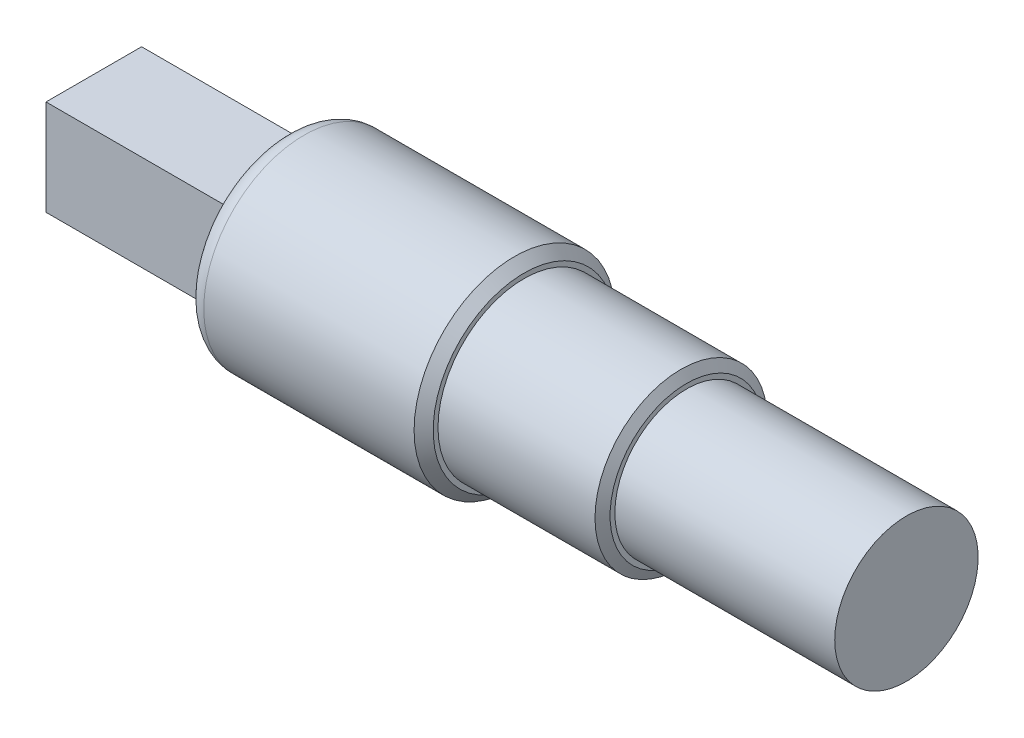
ISO-10303-21;
HEADER;
FILE_DESCRIPTION(('STEP AP214'),'2;1');
FILE_NAME('part.step','',(''),(''),'','','');
FILE_SCHEMA(('AUTOMOTIVE_DESIGN { 1 0 10303 214 1 1 1 1 }'));
ENDSEC;
DATA;
#1=APPLICATION_CONTEXT('core data for automotive mechanical design processes');
#2=APPLICATION_PROTOCOL_DEFINITION('international standard','automotive_design',2000,#1);
#3=PRODUCT_CONTEXT('',#1,'mechanical');
#4=PRODUCT('Part','Part','',(#3));
#5=PRODUCT_RELATED_PRODUCT_CATEGORY('part','',(#4));
#6=PRODUCT_DEFINITION_FORMATION('','',#4);
#7=PRODUCT_DEFINITION_CONTEXT('part definition',#1,'design');
#8=PRODUCT_DEFINITION('design','',#6,#7);
#9=PRODUCT_DEFINITION_SHAPE('','',#8);
#10=(LENGTH_UNIT() NAMED_UNIT(*) SI_UNIT(.MILLI.,.METRE.));
#11=(NAMED_UNIT(*) PLANE_ANGLE_UNIT() SI_UNIT($,.RADIAN.));
#12=(NAMED_UNIT(*) SI_UNIT($,.STERADIAN.) SOLID_ANGLE_UNIT());
#13=UNCERTAINTY_MEASURE_WITH_UNIT(LENGTH_MEASURE(1.E-05),#10,'distance_accuracy_value','');
#14=(GEOMETRIC_REPRESENTATION_CONTEXT(3) GLOBAL_UNCERTAINTY_ASSIGNED_CONTEXT((#13)) GLOBAL_UNIT_ASSIGNED_CONTEXT((#10,
#11,#12)) REPRESENTATION_CONTEXT('',''));
#15=CARTESIAN_POINT('',(0.,0.,0.));
#16=DIRECTION('',(0.,0.,1.));
#17=DIRECTION('',(1.,0.,0.));
#18=AXIS2_PLACEMENT_3D('',#15,#16,#17);
#19=CARTESIAN_POINT('',(0.,0.,0.));
#20=DIRECTION('',(-1.,0.,0.));
#21=DIRECTION('',(0.,0.,1.));
#22=AXIS2_PLACEMENT_3D('',#19,#20,#21);
#23=PLANE('',#22);
#24=CARTESIAN_POINT('',(0.,0.,0.));
#25=DIRECTION('',(-1.,0.,0.));
#26=DIRECTION('',(0.,0.,1.));
#27=AXIS2_PLACEMENT_3D('',#24,#25,#26);
#28=CIRCLE('',#27,8.5);
#29=CARTESIAN_POINT('',(0.,0.,8.5));
#30=VERTEX_POINT('',#29);
#31=EDGE_CURVE('E115',#30,#30,#28,.T.);
#32=ORIENTED_EDGE('',*,*,#31,.T.);
#33=EDGE_LOOP('',(#32));
#34=FACE_BOUND('',#33,.T.);
#35=DIRECTION('',(0.,1.,0.));
#36=VECTOR('',#35,1.);
#37=CARTESIAN_POINT('',(0.,-5.,5.));
#38=LINE('',#37,#36);
#39=CARTESIAN_POINT('',(0.,-5.,5.));
#40=VERTEX_POINT('',#39);
#41=CARTESIAN_POINT('',(0.,5.,5.));
#42=VERTEX_POINT('',#41);
#43=EDGE_CURVE('E55',#40,#42,#38,.T.);
#44=ORIENTED_EDGE('',*,*,#43,.F.);
#45=DIRECTION('',(0.,0.,1.));
#46=VECTOR('',#45,1.);
#47=CARTESIAN_POINT('',(0.,-5.,-5.));
#48=LINE('',#47,#46);
#49=CARTESIAN_POINT('',(0.,-5.,-5.));
#50=VERTEX_POINT('',#49);
#51=EDGE_CURVE('E59',#50,#40,#48,.T.);
#52=ORIENTED_EDGE('',*,*,#51,.F.);
#53=DIRECTION('',(0.,-1.,0.));
#54=VECTOR('',#53,1.);
#55=CARTESIAN_POINT('',(0.,-5.,-5.));
#56=LINE('',#55,#54);
#57=CARTESIAN_POINT('',(0.,5.,-5.));
#58=VERTEX_POINT('',#57);
#59=EDGE_CURVE('E290',#58,#50,#56,.T.);
#60=ORIENTED_EDGE('',*,*,#59,.F.);
#61=DIRECTION('',(0.,0.,-1.));
#62=VECTOR('',#61,1.);
#63=CARTESIAN_POINT('',(0.,5.,-5.));
#64=LINE('',#63,#62);
#65=EDGE_CURVE('E292',#42,#58,#64,.T.);
#66=ORIENTED_EDGE('',*,*,#65,.F.);
#67=EDGE_LOOP('',(#44,#52,#60,#66));
#68=FACE_BOUND('',#67,.T.);
#69=ADVANCED_FACE('F39',(#34,#68),#23,.T.);
#70=CARTESIAN_POINT('',(0.,0.,0.));
#71=DIRECTION('',(-1.,0.,0.));
#72=DIRECTION('',(0.,0.,1.));
#73=AXIS2_PLACEMENT_3D('',#70,#71,#72);
#74=CYLINDRICAL_SURFACE('',#73,10.5);
#75=CARTESIAN_POINT('',(24.,0.,0.));
#76=DIRECTION('',(1.,0.,0.));
#77=DIRECTION('',(0.,0.,-1.));
#78=AXIS2_PLACEMENT_3D('',#75,#76,#77);
#79=CIRCLE('',#78,10.5);
#80=CARTESIAN_POINT('',(24.,0.,-10.5));
#81=VERTEX_POINT('',#80);
#82=EDGE_CURVE('E121',#81,#81,#79,.F.);
#83=ORIENTED_EDGE('',*,*,#82,.T.);
#84=EDGE_LOOP('',(#83));
#85=FACE_BOUND('',#84,.T.);
#86=CARTESIAN_POINT('',(2.,0.,0.));
#87=DIRECTION('',(-1.,0.,0.));
#88=DIRECTION('',(0.,0.,1.));
#89=AXIS2_PLACEMENT_3D('',#86,#87,#88);
#90=CIRCLE('',#89,10.5);
#91=CARTESIAN_POINT('',(2.,0.,10.5));
#92=VERTEX_POINT('',#91);
#93=EDGE_CURVE('E118',#92,#92,#90,.F.);
#94=ORIENTED_EDGE('',*,*,#93,.T.);
#95=EDGE_LOOP('',(#94));
#96=FACE_BOUND('',#95,.T.);
#97=ADVANCED_FACE('F142',(#85,#96),#74,.T.);
#98=CARTESIAN_POINT('',(25.,-10.5,0.));
#99=DIRECTION('',(1.,0.,0.));
#100=DIRECTION('',(0.,0.,-1.));
#101=AXIS2_PLACEMENT_3D('',#98,#99,#100);
#102=PLANE('',#101);
#103=CARTESIAN_POINT('',(25.,0.,0.));
#104=DIRECTION('',(1.,0.,0.));
#105=DIRECTION('',(0.,0.,-1.));
#106=AXIS2_PLACEMENT_3D('',#103,#104,#105);
#107=CIRCLE('',#106,9.49999999999997);
#108=CARTESIAN_POINT('',(25.,0.,-9.49999999999997));
#109=VERTEX_POINT('',#108);
#110=EDGE_CURVE('E124',#109,#109,#107,.T.);
#111=ORIENTED_EDGE('',*,*,#110,.T.);
#112=EDGE_LOOP('',(#111));
#113=FACE_BOUND('',#112,.T.);
#114=CARTESIAN_POINT('',(25.,0.,0.));
#115=DIRECTION('',(-1.,0.,0.));
#116=DIRECTION('',(0.,0.,1.));
#117=AXIS2_PLACEMENT_3D('',#114,#115,#116);
#118=CIRCLE('',#117,9.);
#119=CARTESIAN_POINT('',(25.,0.,9.));
#120=VERTEX_POINT('',#119);
#121=EDGE_CURVE('E112',#120,#120,#118,.T.);
#122=ORIENTED_EDGE('',*,*,#121,.T.);
#123=EDGE_LOOP('',(#122));
#124=FACE_BOUND('',#123,.T.);
#125=ADVANCED_FACE('F148',(#113,#124),#102,.T.);
#126=CARTESIAN_POINT('',(0.,0.,0.));
#127=DIRECTION('',(-1.,0.,0.));
#128=DIRECTION('',(0.,0.,1.));
#129=AXIS2_PLACEMENT_3D('',#126,#127,#128);
#130=CYLINDRICAL_SURFACE('',#129,9.);
#131=CARTESIAN_POINT('',(41.4226497308104,0.,0.));
#132=DIRECTION('',(1.,0.,0.));
#133=DIRECTION('',(0.,0.,-1.));
#134=AXIS2_PLACEMENT_3D('',#131,#132,#133);
#135=CIRCLE('',#134,9.);
#136=CARTESIAN_POINT('',(41.4226497308104,0.,-9.));
#137=VERTEX_POINT('',#136);
#138=EDGE_CURVE('E48',#137,#137,#135,.F.);
#139=ORIENTED_EDGE('',*,*,#138,.T.);
#140=EDGE_LOOP('',(#139));
#141=FACE_BOUND('',#140,.T.);
#142=ORIENTED_EDGE('',*,*,#121,.F.);
#143=EDGE_LOOP('',(#142));
#144=FACE_BOUND('',#143,.T.);
#145=ADVANCED_FACE('F129',(#141,#144),#130,.T.);
#146=CARTESIAN_POINT('',(42.,-9.,0.));
#147=DIRECTION('',(1.,0.,0.));
#148=DIRECTION('',(0.,0.,-1.));
#149=AXIS2_PLACEMENT_3D('',#146,#147,#148);
#150=PLANE('',#149);
#151=CARTESIAN_POINT('',(42.,0.,0.));
#152=DIRECTION('',(1.,0.,0.));
#153=DIRECTION('',(0.,0.,-1.));
#154=AXIS2_PLACEMENT_3D('',#151,#152,#153);
#155=CIRCLE('',#154,8.00000000000001);
#156=CARTESIAN_POINT('',(42.,0.,-8.00000000000001));
#157=VERTEX_POINT('',#156);
#158=EDGE_CURVE('E11',#157,#157,#155,.T.);
#159=ORIENTED_EDGE('',*,*,#158,.T.);
#160=EDGE_LOOP('',(#159));
#161=FACE_BOUND('',#160,.T.);
#162=CARTESIAN_POINT('',(42.,0.,0.));
#163=DIRECTION('',(-1.,0.,0.));
#164=DIRECTION('',(0.,0.,1.));
#165=AXIS2_PLACEMENT_3D('',#162,#163,#164);
#166=CIRCLE('',#165,7.5);
#167=CARTESIAN_POINT('',(42.,0.,7.5));
#168=VERTEX_POINT('',#167);
#169=EDGE_CURVE('E104',#168,#168,#166,.T.);
#170=ORIENTED_EDGE('',*,*,#169,.T.);
#171=EDGE_LOOP('',(#170));
#172=FACE_BOUND('',#171,.T.);
#173=ADVANCED_FACE('F190',(#161,#172),#150,.T.);
#174=CARTESIAN_POINT('',(0.,0.,0.));
#175=DIRECTION('',(-1.,0.,0.));
#176=DIRECTION('',(0.,0.,1.));
#177=AXIS2_PLACEMENT_3D('',#174,#175,#176);
#178=CYLINDRICAL_SURFACE('',#177,7.5);
#179=CARTESIAN_POINT('',(65.,0.,0.));
#180=DIRECTION('',(-1.,0.,0.));
#181=DIRECTION('',(0.,0.,1.));
#182=AXIS2_PLACEMENT_3D('',#179,#180,#181);
#183=CIRCLE('',#182,7.5);
#184=CARTESIAN_POINT('',(65.,0.,7.5));
#185=VERTEX_POINT('',#184);
#186=EDGE_CURVE('E101',#185,#185,#183,.T.);
#187=ORIENTED_EDGE('',*,*,#186,.T.);
#188=EDGE_LOOP('',(#187));
#189=FACE_BOUND('',#188,.T.);
#190=ORIENTED_EDGE('',*,*,#169,.F.);
#191=EDGE_LOOP('',(#190));
#192=FACE_BOUND('',#191,.T.);
#193=ADVANCED_FACE('F186',(#189,#192),#178,.T.);
#194=CARTESIAN_POINT('',(65.,-7.5,0.));
#195=DIRECTION('',(1.,0.,0.));
#196=DIRECTION('',(0.,0.,-1.));
#197=AXIS2_PLACEMENT_3D('',#194,#195,#196);
#198=PLANE('',#197);
#199=ORIENTED_EDGE('',*,*,#186,.F.);
#200=EDGE_LOOP('',(#199));
#201=FACE_BOUND('',#200,.T.);
#202=ADVANCED_FACE('F183',(#201),#198,.T.);
#203=CARTESIAN_POINT('',(-20.,-5.,5.));
#204=DIRECTION('',(0.,0.,-1.));
#205=DIRECTION('',(-1.,0.,0.));
#206=AXIS2_PLACEMENT_3D('',#203,#204,#205);
#207=PLANE('',#206);
#208=ORIENTED_EDGE('',*,*,#43,.T.);
#209=DIRECTION('',(1.,0.,0.));
#210=VECTOR('',#209,1.);
#211=CARTESIAN_POINT('',(-20.,5.,5.));
#212=LINE('',#211,#210);
#213=CARTESIAN_POINT('',(-20.,5.,5.));
#214=VERTEX_POINT('',#213);
#215=EDGE_CURVE('E84',#214,#42,#212,.T.);
#216=ORIENTED_EDGE('',*,*,#215,.F.);
#217=DIRECTION('',(0.,1.,0.));
#218=VECTOR('',#217,1.);
#219=CARTESIAN_POINT('',(-20.,-5.,5.));
#220=LINE('',#219,#218);
#221=CARTESIAN_POINT('',(-20.,-5.,5.));
#222=VERTEX_POINT('',#221);
#223=EDGE_CURVE('E90',#222,#214,#220,.T.);
#224=ORIENTED_EDGE('',*,*,#223,.F.);
#225=DIRECTION('',(1.,0.,0.));
#226=VECTOR('',#225,1.);
#227=CARTESIAN_POINT('',(-20.,-5.,5.));
#228=LINE('',#227,#226);
#229=EDGE_CURVE('E294',#222,#40,#228,.T.);
#230=ORIENTED_EDGE('',*,*,#229,.T.);
#231=EDGE_LOOP('',(#208,#216,#224,#230));
#232=FACE_BOUND('',#231,.T.);
#233=ADVANCED_FACE('F100',(#232),#207,.F.);
#234=CARTESIAN_POINT('',(-20.,5.,-5.));
#235=DIRECTION('',(0.,-1.,0.));
#236=DIRECTION('',(0.,0.,-1.));
#237=AXIS2_PLACEMENT_3D('',#234,#235,#236);
#238=PLANE('',#237);
#239=ORIENTED_EDGE('',*,*,#65,.T.);
#240=DIRECTION('',(1.,0.,0.));
#241=VECTOR('',#240,1.);
#242=CARTESIAN_POINT('',(-20.,5.,-5.));
#243=LINE('',#242,#241);
#244=CARTESIAN_POINT('',(-20.,5.,-5.));
#245=VERTEX_POINT('',#244);
#246=EDGE_CURVE('E86',#245,#58,#243,.T.);
#247=ORIENTED_EDGE('',*,*,#246,.F.);
#248=DIRECTION('',(0.,0.,-1.));
#249=VECTOR('',#248,1.);
#250=CARTESIAN_POINT('',(-20.,5.,-5.));
#251=LINE('',#250,#249);
#252=EDGE_CURVE('E79',#214,#245,#251,.T.);
#253=ORIENTED_EDGE('',*,*,#252,.F.);
#254=ORIENTED_EDGE('',*,*,#215,.T.);
#255=EDGE_LOOP('',(#239,#247,#253,#254));
#256=FACE_BOUND('',#255,.T.);
#257=ADVANCED_FACE('F82',(#256),#238,.F.);
#258=CARTESIAN_POINT('',(-20.,-5.,-5.));
#259=DIRECTION('',(0.,0.,1.));
#260=DIRECTION('',(1.,0.,0.));
#261=AXIS2_PLACEMENT_3D('',#258,#259,#260);
#262=PLANE('',#261);
#263=ORIENTED_EDGE('',*,*,#59,.T.);
#264=DIRECTION('',(1.,0.,0.));
#265=VECTOR('',#264,1.);
#266=CARTESIAN_POINT('',(-20.,-5.,-5.));
#267=LINE('',#266,#265);
#268=CARTESIAN_POINT('',(-20.,-5.,-5.));
#269=VERTEX_POINT('',#268);
#270=EDGE_CURVE('E106',#269,#50,#267,.T.);
#271=ORIENTED_EDGE('',*,*,#270,.F.);
#272=DIRECTION('',(0.,-1.,0.));
#273=VECTOR('',#272,1.);
#274=CARTESIAN_POINT('',(-20.,-5.,-5.));
#275=LINE('',#274,#273);
#276=EDGE_CURVE('E89',#245,#269,#275,.T.);
#277=ORIENTED_EDGE('',*,*,#276,.F.);
#278=ORIENTED_EDGE('',*,*,#246,.T.);
#279=EDGE_LOOP('',(#263,#271,#277,#278));
#280=FACE_BOUND('',#279,.T.);
#281=ADVANCED_FACE('F172',(#280),#262,.F.);
#282=CARTESIAN_POINT('',(-20.,-5.,-5.));
#283=DIRECTION('',(0.,1.,0.));
#284=DIRECTION('',(0.,0.,1.));
#285=AXIS2_PLACEMENT_3D('',#282,#283,#284);
#286=PLANE('',#285);
#287=ORIENTED_EDGE('',*,*,#51,.T.);
#288=ORIENTED_EDGE('',*,*,#229,.F.);
#289=DIRECTION('',(0.,0.,1.));
#290=VECTOR('',#289,1.);
#291=CARTESIAN_POINT('',(-20.,-5.,-5.));
#292=LINE('',#291,#290);
#293=EDGE_CURVE('E95',#269,#222,#292,.T.);
#294=ORIENTED_EDGE('',*,*,#293,.F.);
#295=ORIENTED_EDGE('',*,*,#270,.T.);
#296=EDGE_LOOP('',(#287,#288,#294,#295));
#297=FACE_BOUND('',#296,.T.);
#298=ADVANCED_FACE('F163',(#297),#286,.F.);
#299=CARTESIAN_POINT('',(-20.,0.,0.));
#300=DIRECTION('',(1.,0.,0.));
#301=DIRECTION('',(0.,0.,-1.));
#302=AXIS2_PLACEMENT_3D('',#299,#300,#301);
#303=PLANE('',#302);
#304=ORIENTED_EDGE('',*,*,#223,.T.);
#305=ORIENTED_EDGE('',*,*,#252,.T.);
#306=ORIENTED_EDGE('',*,*,#276,.T.);
#307=ORIENTED_EDGE('',*,*,#293,.T.);
#308=EDGE_LOOP('',(#304,#305,#306,#307));
#309=FACE_BOUND('',#308,.T.);
#310=ADVANCED_FACE('F93',(#309),#303,.F.);
#311=CARTESIAN_POINT('',(2.,0.,0.));
#312=DIRECTION('',(-1.,0.,0.));
#313=DIRECTION('',(0.,0.,1.));
#314=AXIS2_PLACEMENT_3D('',#311,#312,#313);
#315=TOROIDAL_SURFACE('',#314,8.5,2.);
#316=ORIENTED_EDGE('',*,*,#93,.F.);
#317=EDGE_LOOP('',(#316));
#318=FACE_BOUND('',#317,.T.);
#319=ORIENTED_EDGE('',*,*,#31,.F.);
#320=EDGE_LOOP('',(#319));
#321=FACE_BOUND('',#320,.T.);
#322=ADVANCED_FACE('F138',(#318,#321),#315,.T.);
#323=CARTESIAN_POINT('',(24.,0.,0.));
#324=DIRECTION('',(-1.,0.,0.));
#325=DIRECTION('',(0.,0.,1.));
#326=AXIS2_PLACEMENT_3D('',#323,#324,#325);
#327=CONICAL_SURFACE('',#326,10.5,0.785398163397458);
#328=ORIENTED_EDGE('',*,*,#110,.F.);
#329=EDGE_LOOP('',(#328));
#330=FACE_BOUND('',#329,.T.);
#331=ORIENTED_EDGE('',*,*,#82,.F.);
#332=EDGE_LOOP('',(#331));
#333=FACE_BOUND('',#332,.T.);
#334=ADVANCED_FACE('F133',(#330,#333),#327,.T.);
#335=CARTESIAN_POINT('',(41.4226497308104,0.,0.));
#336=DIRECTION('',(-1.,0.,0.));
#337=DIRECTION('',(0.,0.,1.));
#338=AXIS2_PLACEMENT_3D('',#335,#336,#337);
#339=CONICAL_SURFACE('',#338,9.,1.0471975511966);
#340=ORIENTED_EDGE('',*,*,#158,.F.);
#341=EDGE_LOOP('',(#340));
#342=FACE_BOUND('',#341,.T.);
#343=ORIENTED_EDGE('',*,*,#138,.F.);
#344=EDGE_LOOP('',(#343));
#345=FACE_BOUND('',#344,.T.);
#346=ADVANCED_FACE('F42',(#342,#345),#339,.T.);
#347=CLOSED_SHELL('',(#69,#97,#125,#145,#173,#193,#202,#233,#257,#281,#298,#310,#322,#334,#346));
#348=MANIFOLD_SOLID_BREP('B2',#347);
#349=ADVANCED_BREP_SHAPE_REPRESENTATION('',(#18,#348),#14);
#350=SHAPE_DEFINITION_REPRESENTATION(#9,#349);
ENDSEC;
END-ISO-10303-21;
